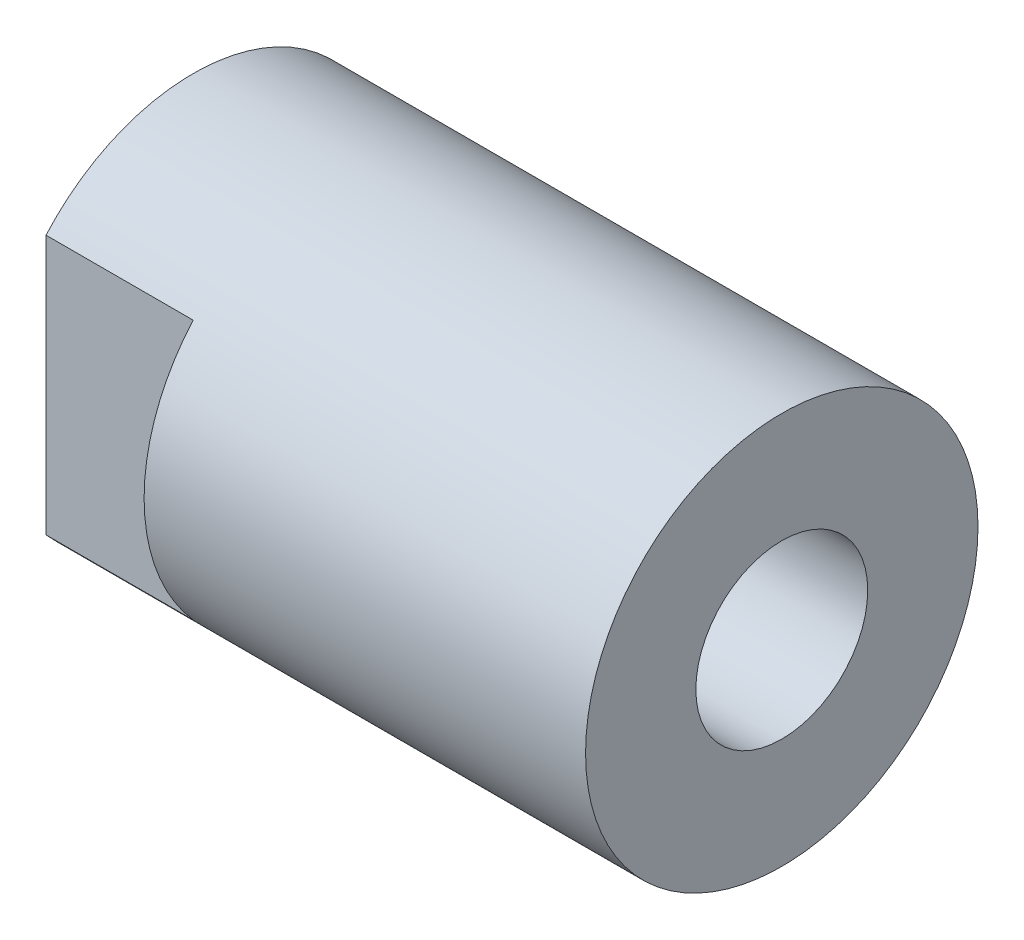
ISO-10303-21;
HEADER;
FILE_DESCRIPTION(('STEP AP214'),'2;1');
FILE_NAME('part.step','',(''),(''),'','','');
FILE_SCHEMA(('AUTOMOTIVE_DESIGN { 1 0 10303 214 1 1 1 1 }'));
ENDSEC;
DATA;
#1=APPLICATION_CONTEXT('core data for automotive mechanical design processes');
#2=APPLICATION_PROTOCOL_DEFINITION('international standard','automotive_design',2000,#1);
#3=PRODUCT_CONTEXT('',#1,'mechanical');
#4=PRODUCT('Part','Part','',(#3));
#5=PRODUCT_RELATED_PRODUCT_CATEGORY('part','',(#4));
#6=PRODUCT_DEFINITION_FORMATION('','',#4);
#7=PRODUCT_DEFINITION_CONTEXT('part definition',#1,'design');
#8=PRODUCT_DEFINITION('design','',#6,#7);
#9=PRODUCT_DEFINITION_SHAPE('','',#8);
#10=(LENGTH_UNIT() NAMED_UNIT(*) SI_UNIT(.MILLI.,.METRE.));
#11=(NAMED_UNIT(*) PLANE_ANGLE_UNIT() SI_UNIT($,.RADIAN.));
#12=(NAMED_UNIT(*) SI_UNIT($,.STERADIAN.) SOLID_ANGLE_UNIT());
#13=UNCERTAINTY_MEASURE_WITH_UNIT(LENGTH_MEASURE(1.E-05),#10,'distance_accuracy_value','');
#14=(GEOMETRIC_REPRESENTATION_CONTEXT(3) GLOBAL_UNCERTAINTY_ASSIGNED_CONTEXT((#13)) GLOBAL_UNIT_ASSIGNED_CONTEXT((#10,
#11,#12)) REPRESENTATION_CONTEXT('',''));
#15=CARTESIAN_POINT('',(0.,0.,0.));
#16=DIRECTION('',(0.,0.,1.));
#17=DIRECTION('',(1.,0.,0.));
#18=AXIS2_PLACEMENT_3D('',#15,#16,#17);
#19=CARTESIAN_POINT('',(38.1,5.5626,0.));
#20=DIRECTION('',(-1.,0.,0.));
#21=DIRECTION('',(0.,0.,1.));
#22=AXIS2_PLACEMENT_3D('',#19,#20,#21);
#23=PLANE('',#22);
#24=CARTESIAN_POINT('',(38.1,0.,0.));
#25=DIRECTION('',(-1.,0.,0.));
#26=DIRECTION('',(0.,0.,1.));
#27=AXIS2_PLACEMENT_3D('',#24,#25,#26);
#28=CIRCLE('',#27,12.7);
#29=CARTESIAN_POINT('',(38.1,0.,12.7));
#30=VERTEX_POINT('',#29);
#31=EDGE_CURVE('E107',#30,#30,#28,.T.);
#32=ORIENTED_EDGE('',*,*,#31,.F.);
#33=EDGE_LOOP('',(#32));
#34=FACE_BOUND('',#33,.T.);
#35=CARTESIAN_POINT('',(38.1,0.,0.));
#36=DIRECTION('',(-1.,0.,0.));
#37=DIRECTION('',(0.,0.,1.));
#38=AXIS2_PLACEMENT_3D('',#35,#36,#37);
#39=CIRCLE('',#38,5.5626);
#40=CARTESIAN_POINT('',(38.1,0.,5.5626));
#41=VERTEX_POINT('',#40);
#42=EDGE_CURVE('E11',#41,#41,#39,.T.);
#43=ORIENTED_EDGE('',*,*,#42,.T.);
#44=EDGE_LOOP('',(#43));
#45=FACE_BOUND('',#44,.T.);
#46=ADVANCED_FACE('F39',(#34,#45),#23,.F.);
#47=CARTESIAN_POINT('',(0.,0.,0.));
#48=DIRECTION('',(-1.,0.,0.));
#49=DIRECTION('',(0.,0.,1.));
#50=AXIS2_PLACEMENT_3D('',#47,#48,#49);
#51=CYLINDRICAL_SURFACE('',#50,5.5626);
#52=ORIENTED_EDGE('',*,*,#42,.F.);
#53=EDGE_LOOP('',(#52));
#54=FACE_BOUND('',#53,.T.);
#55=CARTESIAN_POINT('',(12.7,0.,0.));
#56=DIRECTION('',(-1.,0.,0.));
#57=DIRECTION('',(0.,0.,1.));
#58=AXIS2_PLACEMENT_3D('',#55,#56,#57);
#59=CIRCLE('',#58,5.5626);
#60=CARTESIAN_POINT('',(12.7,0.,5.5626));
#61=VERTEX_POINT('',#60);
#62=EDGE_CURVE('E47',#61,#61,#59,.T.);
#63=ORIENTED_EDGE('',*,*,#62,.T.);
#64=EDGE_LOOP('',(#63));
#65=FACE_BOUND('',#64,.T.);
#66=ADVANCED_FACE('F138',(#54,#65),#51,.F.);
#67=CARTESIAN_POINT('',(12.7,3.175,0.));
#68=DIRECTION('',(-1.,0.,0.));
#69=DIRECTION('',(0.,0.,1.));
#70=AXIS2_PLACEMENT_3D('',#67,#68,#69);
#71=PLANE('',#70);
#72=ORIENTED_EDGE('',*,*,#62,.F.);
#73=EDGE_LOOP('',(#72));
#74=FACE_BOUND('',#73,.T.);
#75=CARTESIAN_POINT('',(12.7,0.,0.));
#76=DIRECTION('',(-1.,0.,0.));
#77=DIRECTION('',(0.,0.,1.));
#78=AXIS2_PLACEMENT_3D('',#75,#76,#77);
#79=CIRCLE('',#78,3.175);
#80=CARTESIAN_POINT('',(12.7,0.,3.175));
#81=VERTEX_POINT('',#80);
#82=EDGE_CURVE('E131',#81,#81,#79,.T.);
#83=ORIENTED_EDGE('',*,*,#82,.T.);
#84=EDGE_LOOP('',(#83));
#85=FACE_BOUND('',#84,.T.);
#86=ADVANCED_FACE('F140',(#74,#85),#71,.F.);
#87=CARTESIAN_POINT('',(0.,0.,0.));
#88=DIRECTION('',(-1.,0.,0.));
#89=DIRECTION('',(0.,0.,1.));
#90=AXIS2_PLACEMENT_3D('',#87,#88,#89);
#91=CYLINDRICAL_SURFACE('',#90,3.175);
#92=ORIENTED_EDGE('',*,*,#82,.F.);
#93=EDGE_LOOP('',(#92));
#94=FACE_BOUND('',#93,.T.);
#95=CARTESIAN_POINT('',(6.35,0.,0.));
#96=DIRECTION('',(-1.,0.,0.));
#97=DIRECTION('',(0.,0.,1.));
#98=AXIS2_PLACEMENT_3D('',#95,#96,#97);
#99=CIRCLE('',#98,3.175);
#100=CARTESIAN_POINT('',(6.35,0.,3.175));
#101=VERTEX_POINT('',#100);
#102=EDGE_CURVE('E127',#101,#101,#99,.T.);
#103=ORIENTED_EDGE('',*,*,#102,.T.);
#104=EDGE_LOOP('',(#103));
#105=FACE_BOUND('',#104,.T.);
#106=ADVANCED_FACE('F143',(#94,#105),#91,.F.);
#107=CARTESIAN_POINT('',(5.20536052075251,0.,0.));
#108=DIRECTION('',(1.,0.,0.));
#109=DIRECTION('',(0.,0.,-1.));
#110=AXIS2_PLACEMENT_3D('',#107,#108,#109);
#111=CONICAL_SURFACE('',#110,1.27,1.02974425867666);
#112=ORIENTED_EDGE('',*,*,#102,.F.);
#113=EDGE_LOOP('',(#112));
#114=FACE_BOUND('',#113,.T.);
#115=CARTESIAN_POINT('',(5.20536052075251,0.,0.));
#116=DIRECTION('',(-1.,0.,0.));
#117=DIRECTION('',(0.,0.,1.));
#118=AXIS2_PLACEMENT_3D('',#115,#116,#117);
#119=CIRCLE('',#118,1.27);
#120=CARTESIAN_POINT('',(5.20536052075251,0.,1.27));
#121=VERTEX_POINT('',#120);
#122=EDGE_CURVE('E123',#121,#121,#119,.T.);
#123=ORIENTED_EDGE('',*,*,#122,.T.);
#124=EDGE_LOOP('',(#123));
#125=FACE_BOUND('',#124,.T.);
#126=ADVANCED_FACE('F149',(#114,#125),#111,.F.);
#127=CARTESIAN_POINT('',(0.,0.,0.));
#128=DIRECTION('',(-1.,0.,0.));
#129=DIRECTION('',(0.,0.,1.));
#130=AXIS2_PLACEMENT_3D('',#127,#128,#129);
#131=CYLINDRICAL_SURFACE('',#130,1.27);
#132=ORIENTED_EDGE('',*,*,#122,.F.);
#133=EDGE_LOOP('',(#132));
#134=FACE_BOUND('',#133,.T.);
#135=CARTESIAN_POINT('',(1.96318561450868,0.,0.));
#136=DIRECTION('',(-1.,0.,0.));
#137=DIRECTION('',(0.,0.,1.));
#138=AXIS2_PLACEMENT_3D('',#135,#136,#137);
#139=CIRCLE('',#138,1.27);
#140=CARTESIAN_POINT('',(1.96318561450868,0.,1.27));
#141=VERTEX_POINT('',#140);
#142=EDGE_CURVE('E119',#141,#141,#139,.T.);
#143=ORIENTED_EDGE('',*,*,#142,.T.);
#144=EDGE_LOOP('',(#143));
#145=FACE_BOUND('',#144,.T.);
#146=ADVANCED_FACE('F155',(#134,#145),#131,.F.);
#147=CARTESIAN_POINT('',(0.,0.,0.));
#148=DIRECTION('',(-1.,0.,0.));
#149=DIRECTION('',(0.,0.,1.));
#150=AXIS2_PLACEMENT_3D('',#147,#148,#149);
#151=CONICAL_SURFACE('',#150,1.796034,0.26179938779915);
#152=ORIENTED_EDGE('',*,*,#142,.F.);
#153=EDGE_LOOP('',(#152));
#154=FACE_BOUND('',#153,.T.);
#155=CARTESIAN_POINT('',(0.,0.,0.));
#156=DIRECTION('',(-1.,0.,0.));
#157=DIRECTION('',(0.,0.,1.));
#158=AXIS2_PLACEMENT_3D('',#155,#156,#157);
#159=CIRCLE('',#158,1.796034);
#160=CARTESIAN_POINT('',(0.,0.,1.796034));
#161=VERTEX_POINT('',#160);
#162=EDGE_CURVE('E111',#161,#161,#159,.T.);
#163=ORIENTED_EDGE('',*,*,#162,.T.);
#164=EDGE_LOOP('',(#163));
#165=FACE_BOUND('',#164,.T.);
#166=ADVANCED_FACE('F161',(#154,#165),#151,.F.);
#167=CARTESIAN_POINT('',(0.,1.796034,0.));
#168=DIRECTION('',(1.,0.,0.));
#169=DIRECTION('',(0.,0.,-1.));
#170=AXIS2_PLACEMENT_3D('',#167,#168,#169);
#171=PLANE('',#170);
#172=ORIENTED_EDGE('',*,*,#162,.F.);
#173=EDGE_LOOP('',(#172));
#174=FACE_BOUND('',#173,.T.);
#175=CARTESIAN_POINT('',(0.,0.,0.));
#176=DIRECTION('',(-1.,0.,0.));
#177=DIRECTION('',(0.,0.,1.));
#178=AXIS2_PLACEMENT_3D('',#175,#176,#177);
#179=CIRCLE('',#178,12.7);
#180=CARTESIAN_POINT('',(0.,8.40026041263007,9.525));
#181=VERTEX_POINT('',#180);
#182=CARTESIAN_POINT('',(0.,8.40026041263007,-9.525));
#183=VERTEX_POINT('',#182);
#184=EDGE_CURVE('E97',#181,#183,#179,.T.);
#185=ORIENTED_EDGE('',*,*,#184,.T.);
#186=DIRECTION('',(0.,1.,0.));
#187=VECTOR('',#186,1.);
#188=CARTESIAN_POINT('',(0.,0.,-9.525));
#189=LINE('',#188,#187);
#190=CARTESIAN_POINT('',(0.,-8.40026041263007,-9.525));
#191=VERTEX_POINT('',#190);
#192=EDGE_CURVE('E82',#191,#183,#189,.T.);
#193=ORIENTED_EDGE('',*,*,#192,.F.);
#194=CARTESIAN_POINT('',(0.,-8.40026041263007,9.525));
#195=VERTEX_POINT('',#194);
#196=EDGE_CURVE('E95',#191,#195,#179,.T.);
#197=ORIENTED_EDGE('',*,*,#196,.T.);
#198=DIRECTION('',(0.,-1.,0.));
#199=VECTOR('',#198,1.);
#200=CARTESIAN_POINT('',(0.,0.,9.525));
#201=LINE('',#200,#199);
#202=EDGE_CURVE('E267',#181,#195,#201,.T.);
#203=ORIENTED_EDGE('',*,*,#202,.F.);
#204=EDGE_LOOP('',(#185,#193,#197,#203));
#205=FACE_BOUND('',#204,.T.);
#206=ADVANCED_FACE('F93',(#174,#205),#171,.F.);
#207=CARTESIAN_POINT('',(0.,0.,0.));
#208=DIRECTION('',(-1.,0.,0.));
#209=DIRECTION('',(0.,0.,1.));
#210=AXIS2_PLACEMENT_3D('',#207,#208,#209);
#211=CYLINDRICAL_SURFACE('',#210,12.7);
#212=CARTESIAN_POINT('',(9.525,0.,0.));
#213=DIRECTION('',(-1.,0.,0.));
#214=DIRECTION('',(0.,0.,1.));
#215=AXIS2_PLACEMENT_3D('',#212,#213,#214);
#216=CIRCLE('',#215,12.7);
#217=CARTESIAN_POINT('',(9.525,8.40026041263007,-9.525));
#218=VERTEX_POINT('',#217);
#219=CARTESIAN_POINT('',(9.525,-8.40026041263007,-9.525));
#220=VERTEX_POINT('',#219);
#221=EDGE_CURVE('E99',#218,#220,#216,.T.);
#222=ORIENTED_EDGE('',*,*,#221,.F.);
#223=DIRECTION('',(-1.,0.,0.));
#224=VECTOR('',#223,1.);
#225=CARTESIAN_POINT('',(9.525,8.40026041263007,-9.525));
#226=LINE('',#225,#224);
#227=EDGE_CURVE('E88',#218,#183,#226,.T.);
#228=ORIENTED_EDGE('',*,*,#227,.T.);
#229=ORIENTED_EDGE('',*,*,#184,.F.);
#230=DIRECTION('',(-1.,0.,0.));
#231=VECTOR('',#230,1.);
#232=CARTESIAN_POINT('',(9.525,8.40026041263007,9.525));
#233=LINE('',#232,#231);
#234=CARTESIAN_POINT('',(9.525,8.40026041263007,9.525));
#235=VERTEX_POINT('',#234);
#236=EDGE_CURVE('E270',#235,#181,#233,.T.);
#237=ORIENTED_EDGE('',*,*,#236,.F.);
#238=CARTESIAN_POINT('',(9.525,0.,0.));
#239=DIRECTION('',(-1.,0.,0.));
#240=DIRECTION('',(0.,0.,1.));
#241=AXIS2_PLACEMENT_3D('',#238,#239,#240);
#242=CIRCLE('',#241,12.7);
#243=CARTESIAN_POINT('',(9.525,-8.40026041263007,9.525));
#244=VERTEX_POINT('',#243);
#245=EDGE_CURVE('E264',#244,#235,#242,.T.);
#246=ORIENTED_EDGE('',*,*,#245,.F.);
#247=DIRECTION('',(-1.,0.,0.));
#248=VECTOR('',#247,1.);
#249=CARTESIAN_POINT('',(9.525,-8.40026041263007,9.525));
#250=LINE('',#249,#248);
#251=EDGE_CURVE('E100',#244,#195,#250,.T.);
#252=ORIENTED_EDGE('',*,*,#251,.T.);
#253=ORIENTED_EDGE('',*,*,#196,.F.);
#254=DIRECTION('',(-1.,0.,0.));
#255=VECTOR('',#254,1.);
#256=CARTESIAN_POINT('',(9.525,-8.40026041263007,-9.525));
#257=LINE('',#256,#255);
#258=EDGE_CURVE('E79',#220,#191,#257,.T.);
#259=ORIENTED_EDGE('',*,*,#258,.F.);
#260=EDGE_LOOP('',(#222,#228,#229,#237,#246,#252,#253,#259));
#261=FACE_BOUND('',#260,.T.);
#262=ORIENTED_EDGE('',*,*,#31,.T.);
#263=EDGE_LOOP('',(#262));
#264=FACE_BOUND('',#263,.T.);
#265=ADVANCED_FACE('F103',(#261,#264),#211,.T.);
#266=CARTESIAN_POINT('',(9.525,0.,9.525));
#267=DIRECTION('',(0.,0.,-1.));
#268=DIRECTION('',(-1.,0.,0.));
#269=AXIS2_PLACEMENT_3D('',#266,#267,#268);
#270=PLANE('',#269);
#271=ORIENTED_EDGE('',*,*,#202,.T.);
#272=ORIENTED_EDGE('',*,*,#251,.F.);
#273=DIRECTION('',(0.,-1.,0.));
#274=VECTOR('',#273,1.);
#275=CARTESIAN_POINT('',(9.525,0.,9.525));
#276=LINE('',#275,#274);
#277=EDGE_CURVE('E60',#235,#244,#276,.T.);
#278=ORIENTED_EDGE('',*,*,#277,.F.);
#279=ORIENTED_EDGE('',*,*,#236,.T.);
#280=EDGE_LOOP('',(#271,#272,#278,#279));
#281=FACE_BOUND('',#280,.T.);
#282=ADVANCED_FACE('F175',(#281),#270,.F.);
#283=CARTESIAN_POINT('',(9.525,0.,0.));
#284=DIRECTION('',(-1.,0.,0.));
#285=DIRECTION('',(0.,0.,1.));
#286=AXIS2_PLACEMENT_3D('',#283,#284,#285);
#287=PLANE('',#286);
#288=ORIENTED_EDGE('',*,*,#245,.T.);
#289=ORIENTED_EDGE('',*,*,#277,.T.);
#290=EDGE_LOOP('',(#288,#289));
#291=FACE_BOUND('',#290,.T.);
#292=ADVANCED_FACE('F227',(#291),#287,.T.);
#293=CARTESIAN_POINT('',(9.525,0.,-9.525));
#294=DIRECTION('',(0.,0.,1.));
#295=DIRECTION('',(1.,0.,0.));
#296=AXIS2_PLACEMENT_3D('',#293,#294,#295);
#297=PLANE('',#296);
#298=ORIENTED_EDGE('',*,*,#192,.T.);
#299=ORIENTED_EDGE('',*,*,#227,.F.);
#300=DIRECTION('',(0.,1.,0.));
#301=VECTOR('',#300,1.);
#302=CARTESIAN_POINT('',(9.525,0.,-9.525));
#303=LINE('',#302,#301);
#304=EDGE_CURVE('E53',#220,#218,#303,.T.);
#305=ORIENTED_EDGE('',*,*,#304,.F.);
#306=ORIENTED_EDGE('',*,*,#258,.T.);
#307=EDGE_LOOP('',(#298,#299,#305,#306));
#308=FACE_BOUND('',#307,.T.);
#309=ADVANCED_FACE('F81',(#308),#297,.F.);
#310=CARTESIAN_POINT('',(9.525,0.,0.));
#311=DIRECTION('',(-1.,0.,0.));
#312=DIRECTION('',(0.,0.,1.));
#313=AXIS2_PLACEMENT_3D('',#310,#311,#312);
#314=PLANE('',#313);
#315=ORIENTED_EDGE('',*,*,#221,.T.);
#316=ORIENTED_EDGE('',*,*,#304,.T.);
#317=EDGE_LOOP('',(#315,#316));
#318=FACE_BOUND('',#317,.T.);
#319=ADVANCED_FACE('F245',(#318),#314,.T.);
#320=CLOSED_SHELL('',(#46,#66,#86,#106,#126,#146,#166,#206,#265,#282,#292,#309,#319));
#321=MANIFOLD_SOLID_BREP('B2',#320);
#322=ADVANCED_BREP_SHAPE_REPRESENTATION('',(#18,#321),#14);
#323=SHAPE_DEFINITION_REPRESENTATION(#9,#322);
ENDSEC;
END-ISO-10303-21;
